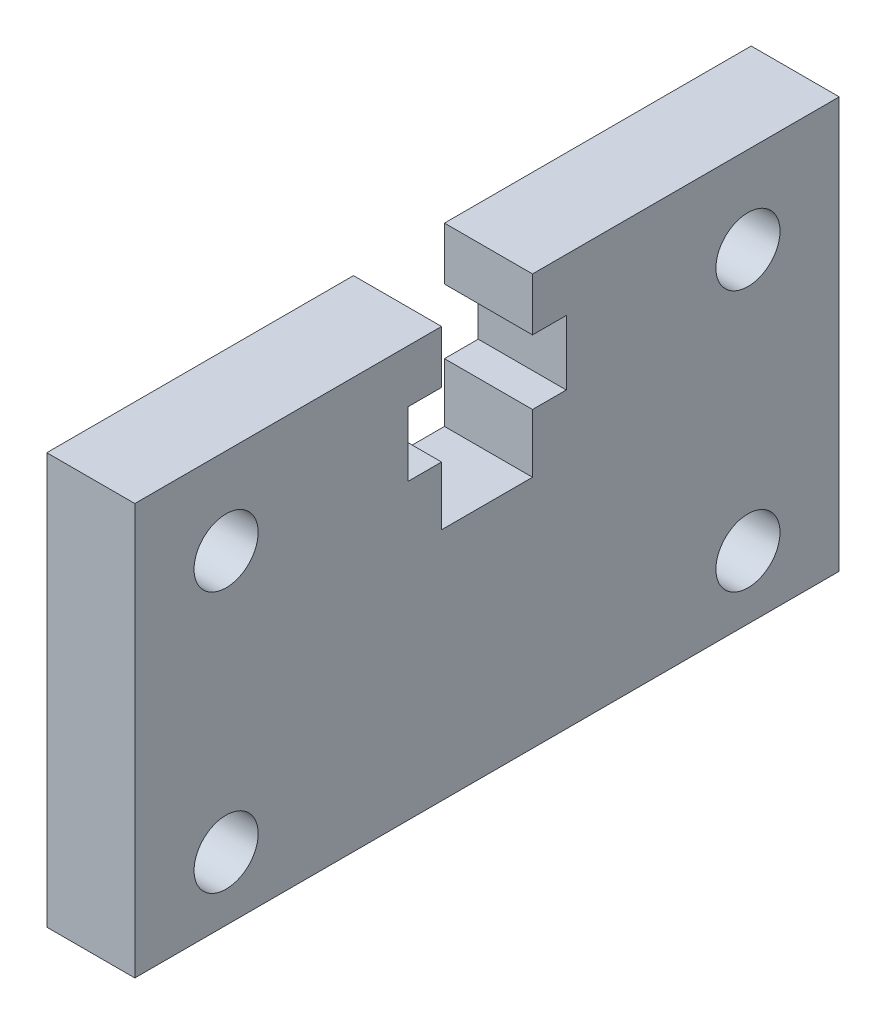
ISO-10303-21;
HEADER;
FILE_DESCRIPTION(('STEP AP214'),'2;1');
FILE_NAME('part.step','',(''),(''),'','','');
FILE_SCHEMA(('AUTOMOTIVE_DESIGN { 1 0 10303 214 1 1 1 1 }'));
ENDSEC;
DATA;
#1=APPLICATION_CONTEXT('core data for automotive mechanical design processes');
#2=APPLICATION_PROTOCOL_DEFINITION('international standard','automotive_design',2000,#1);
#3=PRODUCT_CONTEXT('',#1,'mechanical');
#4=PRODUCT('Part','Part','',(#3));
#5=PRODUCT_RELATED_PRODUCT_CATEGORY('part','',(#4));
#6=PRODUCT_DEFINITION_FORMATION('','',#4);
#7=PRODUCT_DEFINITION_CONTEXT('part definition',#1,'design');
#8=PRODUCT_DEFINITION('design','',#6,#7);
#9=PRODUCT_DEFINITION_SHAPE('','',#8);
#10=(LENGTH_UNIT() NAMED_UNIT(*) SI_UNIT(.MILLI.,.METRE.));
#11=(NAMED_UNIT(*) PLANE_ANGLE_UNIT() SI_UNIT($,.RADIAN.));
#12=(NAMED_UNIT(*) SI_UNIT($,.STERADIAN.) SOLID_ANGLE_UNIT());
#13=UNCERTAINTY_MEASURE_WITH_UNIT(LENGTH_MEASURE(1.E-05),#10,'distance_accuracy_value','');
#14=(GEOMETRIC_REPRESENTATION_CONTEXT(3) GLOBAL_UNCERTAINTY_ASSIGNED_CONTEXT((#13)) GLOBAL_UNIT_ASSIGNED_CONTEXT((#10,
#11,#12)) REPRESENTATION_CONTEXT('',''));
#15=CARTESIAN_POINT('',(0.,0.,0.));
#16=DIRECTION('',(0.,0.,1.));
#17=DIRECTION('',(1.,0.,0.));
#18=AXIS2_PLACEMENT_3D('',#15,#16,#17);
#19=CARTESIAN_POINT('',(3.,14.,0.));
#20=DIRECTION('',(0.,-1.,0.));
#21=DIRECTION('',(0.,0.,-1.));
#22=AXIS2_PLACEMENT_3D('',#19,#20,#21);
#23=PLANE('',#22);
#24=DIRECTION('',(1.,0.,0.));
#25=VECTOR('',#24,1.);
#26=CARTESIAN_POINT('',(0.,14.,-13.55));
#27=LINE('',#26,#25);
#28=CARTESIAN_POINT('',(0.,14.,-13.55));
#29=VERTEX_POINT('',#28);
#30=CARTESIAN_POINT('',(3.,14.,-13.55));
#31=VERTEX_POINT('',#30);
#32=EDGE_CURVE('E230',#29,#31,#27,.T.);
#33=ORIENTED_EDGE('',*,*,#32,.T.);
#34=DIRECTION('',(0.,0.,1.));
#35=VECTOR('',#34,1.);
#36=CARTESIAN_POINT('',(3.,14.,0.));
#37=LINE('',#36,#35);
#38=CARTESIAN_POINT('',(3.,14.,-24.));
#39=VERTEX_POINT('',#38);
#40=EDGE_CURVE('E280',#39,#31,#37,.T.);
#41=ORIENTED_EDGE('',*,*,#40,.F.);
#42=DIRECTION('',(-1.,0.,0.));
#43=VECTOR('',#42,1.);
#44=CARTESIAN_POINT('',(3.,14.,-24.));
#45=LINE('',#44,#43);
#46=CARTESIAN_POINT('',(0.,14.,-24.));
#47=VERTEX_POINT('',#46);
#48=EDGE_CURVE('E293',#39,#47,#45,.T.);
#49=ORIENTED_EDGE('',*,*,#48,.T.);
#50=DIRECTION('',(0.,0.,1.));
#51=VECTOR('',#50,1.);
#52=CARTESIAN_POINT('',(0.,14.,0.));
#53=LINE('',#52,#51);
#54=EDGE_CURVE('E276',#47,#29,#53,.T.);
#55=ORIENTED_EDGE('',*,*,#54,.T.);
#56=EDGE_LOOP('',(#33,#41,#49,#55));
#57=FACE_BOUND('',#56,.T.);
#58=ADVANCED_FACE('F33',(#57),#23,.F.);
#59=CARTESIAN_POINT('',(3.,0.,0.));
#60=DIRECTION('',(0.,0.,-1.));
#61=DIRECTION('',(-1.,0.,0.));
#62=AXIS2_PLACEMENT_3D('',#59,#60,#61);
#63=PLANE('',#62);
#64=DIRECTION('',(0.,-1.,0.));
#65=VECTOR('',#64,1.);
#66=CARTESIAN_POINT('',(0.,0.,0.));
#67=LINE('',#66,#65);
#68=CARTESIAN_POINT('',(0.,14.,0.));
#69=VERTEX_POINT('',#68);
#70=CARTESIAN_POINT('',(0.,0.,0.));
#71=VERTEX_POINT('',#70);
#72=EDGE_CURVE('E273',#69,#71,#67,.T.);
#73=ORIENTED_EDGE('',*,*,#72,.T.);
#74=DIRECTION('',(-1.,0.,0.));
#75=VECTOR('',#74,1.);
#76=CARTESIAN_POINT('',(3.,0.,0.));
#77=LINE('',#76,#75);
#78=CARTESIAN_POINT('',(3.,0.,0.));
#79=VERTEX_POINT('',#78);
#80=EDGE_CURVE('E11',#79,#71,#77,.T.);
#81=ORIENTED_EDGE('',*,*,#80,.F.);
#82=DIRECTION('',(0.,-1.,0.));
#83=VECTOR('',#82,1.);
#84=CARTESIAN_POINT('',(3.,0.,0.));
#85=LINE('',#84,#83);
#86=CARTESIAN_POINT('',(3.,14.,0.));
#87=VERTEX_POINT('',#86);
#88=EDGE_CURVE('E274',#87,#79,#85,.T.);
#89=ORIENTED_EDGE('',*,*,#88,.F.);
#90=DIRECTION('',(-1.,0.,0.));
#91=VECTOR('',#90,1.);
#92=CARTESIAN_POINT('',(3.,14.,0.));
#93=LINE('',#92,#91);
#94=EDGE_CURVE('E283',#87,#69,#93,.T.);
#95=ORIENTED_EDGE('',*,*,#94,.T.);
#96=EDGE_LOOP('',(#73,#81,#89,#95));
#97=FACE_BOUND('',#96,.T.);
#98=ADVANCED_FACE('F35',(#97),#63,.F.);
#99=CARTESIAN_POINT('',(3.,0.,0.));
#100=DIRECTION('',(0.,1.,0.));
#101=DIRECTION('',(0.,0.,1.));
#102=AXIS2_PLACEMENT_3D('',#99,#100,#101);
#103=PLANE('',#102);
#104=DIRECTION('',(0.,0.,-1.));
#105=VECTOR('',#104,1.);
#106=CARTESIAN_POINT('',(0.,0.,0.));
#107=LINE('',#106,#105);
#108=CARTESIAN_POINT('',(0.,0.,-24.));
#109=VERTEX_POINT('',#108);
#110=EDGE_CURVE('E286',#71,#109,#107,.T.);
#111=ORIENTED_EDGE('',*,*,#110,.T.);
#112=DIRECTION('',(-1.,0.,0.));
#113=VECTOR('',#112,1.);
#114=CARTESIAN_POINT('',(3.,0.,-24.));
#115=LINE('',#114,#113);
#116=CARTESIAN_POINT('',(3.,0.,-24.));
#117=VERTEX_POINT('',#116);
#118=EDGE_CURVE('E41',#117,#109,#115,.T.);
#119=ORIENTED_EDGE('',*,*,#118,.F.);
#120=DIRECTION('',(0.,0.,-1.));
#121=VECTOR('',#120,1.);
#122=CARTESIAN_POINT('',(3.,0.,0.));
#123=LINE('',#122,#121);
#124=EDGE_CURVE('E86',#79,#117,#123,.T.);
#125=ORIENTED_EDGE('',*,*,#124,.F.);
#126=ORIENTED_EDGE('',*,*,#80,.T.);
#127=EDGE_LOOP('',(#111,#119,#125,#126));
#128=FACE_BOUND('',#127,.T.);
#129=ADVANCED_FACE('F311',(#128),#103,.F.);
#130=CARTESIAN_POINT('',(3.,0.,-24.));
#131=DIRECTION('',(0.,0.,1.));
#132=DIRECTION('',(1.,0.,0.));
#133=AXIS2_PLACEMENT_3D('',#130,#131,#132);
#134=PLANE('',#133);
#135=DIRECTION('',(0.,1.,0.));
#136=VECTOR('',#135,1.);
#137=CARTESIAN_POINT('',(0.,0.,-24.));
#138=LINE('',#137,#136);
#139=EDGE_CURVE('E288',#109,#47,#138,.T.);
#140=ORIENTED_EDGE('',*,*,#139,.T.);
#141=ORIENTED_EDGE('',*,*,#48,.F.);
#142=DIRECTION('',(0.,1.,0.));
#143=VECTOR('',#142,1.);
#144=CARTESIAN_POINT('',(3.,0.,-24.));
#145=LINE('',#144,#143);
#146=EDGE_CURVE('E278',#117,#39,#145,.T.);
#147=ORIENTED_EDGE('',*,*,#146,.F.);
#148=ORIENTED_EDGE('',*,*,#118,.T.);
#149=EDGE_LOOP('',(#140,#141,#147,#148));
#150=FACE_BOUND('',#149,.T.);
#151=ADVANCED_FACE('F299',(#150),#134,.F.);
#152=CARTESIAN_POINT('',(3.,14.,-10.45));
#153=VERTEX_POINT('',#152);
#154=EDGE_CURVE('E57',#153,#87,#37,.T.);
#155=ORIENTED_EDGE('',*,*,#154,.F.);
#156=DIRECTION('',(1.,0.,0.));
#157=VECTOR('',#156,1.);
#158=CARTESIAN_POINT('',(0.,14.,-10.45));
#159=LINE('',#158,#157);
#160=CARTESIAN_POINT('',(0.,14.,-10.45));
#161=VERTEX_POINT('',#160);
#162=EDGE_CURVE('E227',#161,#153,#159,.T.);
#163=ORIENTED_EDGE('',*,*,#162,.F.);
#164=EDGE_CURVE('E79',#161,#69,#53,.T.);
#165=ORIENTED_EDGE('',*,*,#164,.T.);
#166=ORIENTED_EDGE('',*,*,#94,.F.);
#167=EDGE_LOOP('',(#155,#163,#165,#166));
#168=FACE_BOUND('',#167,.T.);
#169=ADVANCED_FACE('F317',(#168),#23,.F.);
#170=CARTESIAN_POINT('',(3.,0.,0.));
#171=DIRECTION('',(-1.,0.,0.));
#172=DIRECTION('',(0.,0.,1.));
#173=AXIS2_PLACEMENT_3D('',#170,#171,#172);
#174=PLANE('',#173);
#175=DIRECTION('',(0.,0.,1.));
#176=VECTOR('',#175,1.);
#177=CARTESIAN_POINT('',(3.,12.2,0.));
#178=LINE('',#177,#176);
#179=CARTESIAN_POINT('',(3.,12.2,-10.45));
#180=VERTEX_POINT('',#179);
#181=CARTESIAN_POINT('',(3.,12.2,-9.3));
#182=VERTEX_POINT('',#181);
#183=EDGE_CURVE('E202',#180,#182,#178,.T.);
#184=ORIENTED_EDGE('',*,*,#183,.F.);
#185=DIRECTION('',(0.,-1.,0.));
#186=VECTOR('',#185,1.);
#187=CARTESIAN_POINT('',(3.,0.,-10.45));
#188=LINE('',#187,#186);
#189=EDGE_CURVE('E161',#153,#180,#188,.T.);
#190=ORIENTED_EDGE('',*,*,#189,.F.);
#191=ORIENTED_EDGE('',*,*,#154,.T.);
#192=ORIENTED_EDGE('',*,*,#88,.T.);
#193=ORIENTED_EDGE('',*,*,#124,.T.);
#194=ORIENTED_EDGE('',*,*,#146,.T.);
#195=ORIENTED_EDGE('',*,*,#40,.T.);
#196=DIRECTION('',(0.,-1.,0.));
#197=VECTOR('',#196,1.);
#198=CARTESIAN_POINT('',(3.,0.,-13.55));
#199=LINE('',#198,#197);
#200=CARTESIAN_POINT('',(3.,12.2,-13.55));
#201=VERTEX_POINT('',#200);
#202=EDGE_CURVE('E176',#31,#201,#199,.T.);
#203=ORIENTED_EDGE('',*,*,#202,.T.);
#204=DIRECTION('',(0.,0.,1.));
#205=VECTOR('',#204,1.);
#206=CARTESIAN_POINT('',(3.,12.2,0.));
#207=LINE('',#206,#205);
#208=CARTESIAN_POINT('',(3.,12.2,-14.7));
#209=VERTEX_POINT('',#208);
#210=EDGE_CURVE('E179',#209,#201,#207,.T.);
#211=ORIENTED_EDGE('',*,*,#210,.F.);
#212=DIRECTION('',(0.,-1.,0.));
#213=VECTOR('',#212,1.);
#214=CARTESIAN_POINT('',(3.,0.,-14.7));
#215=LINE('',#214,#213);
#216=CARTESIAN_POINT('',(3.,10.,-14.7));
#217=VERTEX_POINT('',#216);
#218=EDGE_CURVE('E222',#209,#217,#215,.T.);
#219=ORIENTED_EDGE('',*,*,#218,.T.);
#220=DIRECTION('',(0.,0.,1.));
#221=VECTOR('',#220,1.);
#222=CARTESIAN_POINT('',(3.,10.,0.));
#223=LINE('',#222,#221);
#224=CARTESIAN_POINT('',(3.,10.,-13.55));
#225=VERTEX_POINT('',#224);
#226=EDGE_CURVE('E219',#217,#225,#223,.T.);
#227=ORIENTED_EDGE('',*,*,#226,.T.);
#228=DIRECTION('',(0.,-1.,0.));
#229=VECTOR('',#228,1.);
#230=CARTESIAN_POINT('',(3.,0.,-13.55));
#231=LINE('',#230,#229);
#232=CARTESIAN_POINT('',(3.,8.,-13.55));
#233=VERTEX_POINT('',#232);
#234=EDGE_CURVE('E216',#225,#233,#231,.T.);
#235=ORIENTED_EDGE('',*,*,#234,.T.);
#236=DIRECTION('',(0.,0.,-1.));
#237=VECTOR('',#236,1.);
#238=CARTESIAN_POINT('',(3.,8.00000000000001,0.));
#239=LINE('',#238,#237);
#240=CARTESIAN_POINT('',(3.,8.,-10.45));
#241=VERTEX_POINT('',#240);
#242=EDGE_CURVE('E213',#241,#233,#239,.T.);
#243=ORIENTED_EDGE('',*,*,#242,.F.);
#244=DIRECTION('',(0.,-1.,0.));
#245=VECTOR('',#244,1.);
#246=CARTESIAN_POINT('',(3.,0.,-10.45));
#247=LINE('',#246,#245);
#248=CARTESIAN_POINT('',(3.,10.,-10.45));
#249=VERTEX_POINT('',#248);
#250=EDGE_CURVE('E210',#249,#241,#247,.T.);
#251=ORIENTED_EDGE('',*,*,#250,.F.);
#252=DIRECTION('',(0.,0.,1.));
#253=VECTOR('',#252,1.);
#254=CARTESIAN_POINT('',(3.,10.,0.));
#255=LINE('',#254,#253);
#256=CARTESIAN_POINT('',(3.,10.,-9.3));
#257=VERTEX_POINT('',#256);
#258=EDGE_CURVE('E207',#249,#257,#255,.T.);
#259=ORIENTED_EDGE('',*,*,#258,.T.);
#260=DIRECTION('',(0.,-1.,0.));
#261=VECTOR('',#260,1.);
#262=CARTESIAN_POINT('',(3.,0.,-9.3));
#263=LINE('',#262,#261);
#264=EDGE_CURVE('E204',#182,#257,#263,.T.);
#265=ORIENTED_EDGE('',*,*,#264,.F.);
#266=EDGE_LOOP('',(#184,#190,#191,#192,#193,#194,#195,#203,#211,#219,#227,#235,#243,#251,#259,#265));
#267=FACE_BOUND('',#266,.T.);
#268=CARTESIAN_POINT('',(3.,11.05,-3.11));
#269=DIRECTION('',(1.,0.,0.));
#270=DIRECTION('',(0.,0.,-1.));
#271=AXIS2_PLACEMENT_3D('',#268,#269,#270);
#272=CIRCLE('',#271,1.0922);
#273=CARTESIAN_POINT('',(3.,11.05,-4.2022));
#274=VERTEX_POINT('',#273);
#275=EDGE_CURVE('E229',#274,#274,#272,.T.);
#276=ORIENTED_EDGE('',*,*,#275,.F.);
#277=EDGE_LOOP('',(#276));
#278=FACE_BOUND('',#277,.T.);
#279=CARTESIAN_POINT('',(3.,11.049,-20.8899999718785));
#280=DIRECTION('',(1.,0.,0.));
#281=DIRECTION('',(0.,0.,-1.));
#282=AXIS2_PLACEMENT_3D('',#279,#280,#281);
#283=CIRCLE('',#282,1.0922);
#284=CARTESIAN_POINT('',(3.,11.049,-21.9821999718785));
#285=VERTEX_POINT('',#284);
#286=EDGE_CURVE('E255',#285,#285,#283,.T.);
#287=ORIENTED_EDGE('',*,*,#286,.F.);
#288=EDGE_LOOP('',(#287));
#289=FACE_BOUND('',#288,.T.);
#290=CARTESIAN_POINT('',(3.,2.159,-20.889999943757));
#291=DIRECTION('',(1.,0.,0.));
#292=DIRECTION('',(0.,0.,-1.));
#293=AXIS2_PLACEMENT_3D('',#290,#291,#292);
#294=CIRCLE('',#293,1.0922);
#295=CARTESIAN_POINT('',(3.,2.159,-21.982199943757));
#296=VERTEX_POINT('',#295);
#297=EDGE_CURVE('E261',#296,#296,#294,.T.);
#298=ORIENTED_EDGE('',*,*,#297,.F.);
#299=EDGE_LOOP('',(#298));
#300=FACE_BOUND('',#299,.T.);
#301=CARTESIAN_POINT('',(3.,2.16,-3.11));
#302=DIRECTION('',(1.,0.,0.));
#303=DIRECTION('',(0.,0.,-1.));
#304=AXIS2_PLACEMENT_3D('',#301,#302,#303);
#305=CIRCLE('',#304,1.0922);
#306=CARTESIAN_POINT('',(3.,2.16,-4.2022));
#307=VERTEX_POINT('',#306);
#308=EDGE_CURVE('E267',#307,#307,#305,.T.);
#309=ORIENTED_EDGE('',*,*,#308,.F.);
#310=EDGE_LOOP('',(#309));
#311=FACE_BOUND('',#310,.T.);
#312=ADVANCED_FACE('F305',(#267,#278,#289,#300,#311),#174,.F.);
#313=CARTESIAN_POINT('',(0.,0.,0.));
#314=DIRECTION('',(-1.,0.,0.));
#315=DIRECTION('',(0.,0.,1.));
#316=AXIS2_PLACEMENT_3D('',#313,#314,#315);
#317=PLANE('',#316);
#318=DIRECTION('',(0.,-1.,0.));
#319=VECTOR('',#318,1.);
#320=CARTESIAN_POINT('',(0.,0.,-10.45));
#321=LINE('',#320,#319);
#322=CARTESIAN_POINT('',(0.,12.2,-10.45));
#323=VERTEX_POINT('',#322);
#324=EDGE_CURVE('E160',#161,#323,#321,.T.);
#325=ORIENTED_EDGE('',*,*,#324,.T.);
#326=DIRECTION('',(0.,0.,1.));
#327=VECTOR('',#326,1.);
#328=CARTESIAN_POINT('',(0.,12.2,0.));
#329=LINE('',#328,#327);
#330=CARTESIAN_POINT('',(0.,12.2,-9.3));
#331=VERTEX_POINT('',#330);
#332=EDGE_CURVE('E169',#323,#331,#329,.T.);
#333=ORIENTED_EDGE('',*,*,#332,.T.);
#334=DIRECTION('',(0.,-1.,0.));
#335=VECTOR('',#334,1.);
#336=CARTESIAN_POINT('',(0.,0.,-9.3));
#337=LINE('',#336,#335);
#338=CARTESIAN_POINT('',(0.,10.,-9.3));
#339=VERTEX_POINT('',#338);
#340=EDGE_CURVE('E48',#331,#339,#337,.T.);
#341=ORIENTED_EDGE('',*,*,#340,.T.);
#342=DIRECTION('',(0.,0.,1.));
#343=VECTOR('',#342,1.);
#344=CARTESIAN_POINT('',(0.,10.,0.));
#345=LINE('',#344,#343);
#346=CARTESIAN_POINT('',(0.,10.,-10.45));
#347=VERTEX_POINT('',#346);
#348=EDGE_CURVE('E183',#347,#339,#345,.T.);
#349=ORIENTED_EDGE('',*,*,#348,.F.);
#350=DIRECTION('',(0.,-1.,0.));
#351=VECTOR('',#350,1.);
#352=CARTESIAN_POINT('',(0.,0.,-10.45));
#353=LINE('',#352,#351);
#354=CARTESIAN_POINT('',(0.,8.,-10.45));
#355=VERTEX_POINT('',#354);
#356=EDGE_CURVE('E185',#347,#355,#353,.T.);
#357=ORIENTED_EDGE('',*,*,#356,.T.);
#358=DIRECTION('',(0.,0.,-1.));
#359=VECTOR('',#358,1.);
#360=CARTESIAN_POINT('',(0.,8.00000000000001,0.));
#361=LINE('',#360,#359);
#362=CARTESIAN_POINT('',(0.,8.,-13.55));
#363=VERTEX_POINT('',#362);
#364=EDGE_CURVE('E188',#355,#363,#361,.T.);
#365=ORIENTED_EDGE('',*,*,#364,.T.);
#366=DIRECTION('',(0.,-1.,0.));
#367=VECTOR('',#366,1.);
#368=CARTESIAN_POINT('',(0.,0.,-13.55));
#369=LINE('',#368,#367);
#370=CARTESIAN_POINT('',(0.,10.,-13.55));
#371=VERTEX_POINT('',#370);
#372=EDGE_CURVE('E191',#371,#363,#369,.T.);
#373=ORIENTED_EDGE('',*,*,#372,.F.);
#374=DIRECTION('',(0.,0.,1.));
#375=VECTOR('',#374,1.);
#376=CARTESIAN_POINT('',(0.,10.,0.));
#377=LINE('',#376,#375);
#378=CARTESIAN_POINT('',(0.,10.,-14.7));
#379=VERTEX_POINT('',#378);
#380=EDGE_CURVE('E193',#379,#371,#377,.T.);
#381=ORIENTED_EDGE('',*,*,#380,.F.);
#382=DIRECTION('',(0.,-1.,0.));
#383=VECTOR('',#382,1.);
#384=CARTESIAN_POINT('',(0.,0.,-14.7));
#385=LINE('',#384,#383);
#386=CARTESIAN_POINT('',(0.,12.2,-14.7));
#387=VERTEX_POINT('',#386);
#388=EDGE_CURVE('E195',#387,#379,#385,.T.);
#389=ORIENTED_EDGE('',*,*,#388,.F.);
#390=DIRECTION('',(0.,0.,1.));
#391=VECTOR('',#390,1.);
#392=CARTESIAN_POINT('',(0.,12.2,0.));
#393=LINE('',#392,#391);
#394=CARTESIAN_POINT('',(0.,12.2,-13.55));
#395=VERTEX_POINT('',#394);
#396=EDGE_CURVE('E197',#387,#395,#393,.T.);
#397=ORIENTED_EDGE('',*,*,#396,.T.);
#398=DIRECTION('',(0.,-1.,0.));
#399=VECTOR('',#398,1.);
#400=CARTESIAN_POINT('',(0.,0.,-13.55));
#401=LINE('',#400,#399);
#402=EDGE_CURVE('E166',#29,#395,#401,.T.);
#403=ORIENTED_EDGE('',*,*,#402,.F.);
#404=ORIENTED_EDGE('',*,*,#54,.F.);
#405=ORIENTED_EDGE('',*,*,#139,.F.);
#406=ORIENTED_EDGE('',*,*,#110,.F.);
#407=ORIENTED_EDGE('',*,*,#72,.F.);
#408=ORIENTED_EDGE('',*,*,#164,.F.);
#409=EDGE_LOOP('',(#325,#333,#341,#349,#357,#365,#373,#381,#389,#397,#403,#404,#405,#406,#407,#408));
#410=FACE_BOUND('',#409,.T.);
#411=CARTESIAN_POINT('',(0.,11.05,-3.11));
#412=DIRECTION('',(1.,0.,0.));
#413=DIRECTION('',(0.,0.,-1.));
#414=AXIS2_PLACEMENT_3D('',#411,#412,#413);
#415=CIRCLE('',#414,1.0922);
#416=CARTESIAN_POINT('',(0.,11.05,-4.2022));
#417=VERTEX_POINT('',#416);
#418=EDGE_CURVE('E252',#417,#417,#415,.T.);
#419=ORIENTED_EDGE('',*,*,#418,.T.);
#420=EDGE_LOOP('',(#419));
#421=FACE_BOUND('',#420,.T.);
#422=CARTESIAN_POINT('',(0.,11.049,-20.8899999718785));
#423=DIRECTION('',(1.,0.,0.));
#424=DIRECTION('',(0.,0.,-1.));
#425=AXIS2_PLACEMENT_3D('',#422,#423,#424);
#426=CIRCLE('',#425,1.0922);
#427=CARTESIAN_POINT('',(0.,11.049,-21.9821999718785));
#428=VERTEX_POINT('',#427);
#429=EDGE_CURVE('E258',#428,#428,#426,.T.);
#430=ORIENTED_EDGE('',*,*,#429,.T.);
#431=EDGE_LOOP('',(#430));
#432=FACE_BOUND('',#431,.T.);
#433=CARTESIAN_POINT('',(0.,2.159,-20.889999943757));
#434=DIRECTION('',(1.,0.,0.));
#435=DIRECTION('',(0.,0.,-1.));
#436=AXIS2_PLACEMENT_3D('',#433,#434,#435);
#437=CIRCLE('',#436,1.0922);
#438=CARTESIAN_POINT('',(0.,2.159,-21.982199943757));
#439=VERTEX_POINT('',#438);
#440=EDGE_CURVE('E264',#439,#439,#437,.T.);
#441=ORIENTED_EDGE('',*,*,#440,.T.);
#442=EDGE_LOOP('',(#441));
#443=FACE_BOUND('',#442,.T.);
#444=CARTESIAN_POINT('',(0.,2.16,-3.11));
#445=DIRECTION('',(1.,0.,0.));
#446=DIRECTION('',(0.,0.,-1.));
#447=AXIS2_PLACEMENT_3D('',#444,#445,#446);
#448=CIRCLE('',#447,1.0922);
#449=CARTESIAN_POINT('',(0.,2.16,-4.2022));
#450=VERTEX_POINT('',#449);
#451=EDGE_CURVE('E270',#450,#450,#448,.T.);
#452=ORIENTED_EDGE('',*,*,#451,.T.);
#453=EDGE_LOOP('',(#452));
#454=FACE_BOUND('',#453,.T.);
#455=ADVANCED_FACE('F173',(#410,#421,#432,#443,#454),#317,.T.);
#456=CARTESIAN_POINT('',(3.,2.16,-3.11));
#457=DIRECTION('',(1.,0.,0.));
#458=DIRECTION('',(0.,0.,-1.));
#459=AXIS2_PLACEMENT_3D('',#456,#457,#458);
#460=CYLINDRICAL_SURFACE('',#459,1.0922);
#461=ORIENTED_EDGE('',*,*,#451,.F.);
#462=EDGE_LOOP('',(#461));
#463=FACE_BOUND('',#462,.T.);
#464=ORIENTED_EDGE('',*,*,#308,.T.);
#465=EDGE_LOOP('',(#464));
#466=FACE_BOUND('',#465,.T.);
#467=ADVANCED_FACE('F400',(#463,#466),#460,.F.);
#468=CARTESIAN_POINT('',(3.,2.159,-20.889999943757));
#469=DIRECTION('',(1.,0.,0.));
#470=DIRECTION('',(0.,0.,-1.));
#471=AXIS2_PLACEMENT_3D('',#468,#469,#470);
#472=CYLINDRICAL_SURFACE('',#471,1.0922);
#473=ORIENTED_EDGE('',*,*,#440,.F.);
#474=EDGE_LOOP('',(#473));
#475=FACE_BOUND('',#474,.T.);
#476=ORIENTED_EDGE('',*,*,#297,.T.);
#477=EDGE_LOOP('',(#476));
#478=FACE_BOUND('',#477,.T.);
#479=ADVANCED_FACE('F396',(#475,#478),#472,.F.);
#480=CARTESIAN_POINT('',(3.,11.049,-20.8899999718785));
#481=DIRECTION('',(1.,0.,0.));
#482=DIRECTION('',(0.,0.,-1.));
#483=AXIS2_PLACEMENT_3D('',#480,#481,#482);
#484=CYLINDRICAL_SURFACE('',#483,1.0922);
#485=ORIENTED_EDGE('',*,*,#429,.F.);
#486=EDGE_LOOP('',(#485));
#487=FACE_BOUND('',#486,.T.);
#488=ORIENTED_EDGE('',*,*,#286,.T.);
#489=EDGE_LOOP('',(#488));
#490=FACE_BOUND('',#489,.T.);
#491=ADVANCED_FACE('F392',(#487,#490),#484,.F.);
#492=CARTESIAN_POINT('',(3.,11.05,-3.11));
#493=DIRECTION('',(1.,0.,0.));
#494=DIRECTION('',(0.,0.,-1.));
#495=AXIS2_PLACEMENT_3D('',#492,#493,#494);
#496=CYLINDRICAL_SURFACE('',#495,1.0922);
#497=ORIENTED_EDGE('',*,*,#418,.F.);
#498=EDGE_LOOP('',(#497));
#499=FACE_BOUND('',#498,.T.);
#500=ORIENTED_EDGE('',*,*,#275,.T.);
#501=EDGE_LOOP('',(#500));
#502=FACE_BOUND('',#501,.T.);
#503=ADVANCED_FACE('F371',(#499,#502),#496,.F.);
#504=CARTESIAN_POINT('',(0.,0.,-10.45));
#505=DIRECTION('',(0.,0.,1.));
#506=DIRECTION('',(0.,-1.,0.));
#507=AXIS2_PLACEMENT_3D('',#504,#505,#506);
#508=PLANE('',#507);
#509=ORIENTED_EDGE('',*,*,#189,.T.);
#510=DIRECTION('',(1.,0.,0.));
#511=VECTOR('',#510,1.);
#512=CARTESIAN_POINT('',(0.,12.2,-10.45));
#513=LINE('',#512,#511);
#514=EDGE_CURVE('E156',#323,#180,#513,.T.);
#515=ORIENTED_EDGE('',*,*,#514,.F.);
#516=ORIENTED_EDGE('',*,*,#324,.F.);
#517=ORIENTED_EDGE('',*,*,#162,.T.);
#518=EDGE_LOOP('',(#509,#515,#516,#517));
#519=FACE_BOUND('',#518,.T.);
#520=ADVANCED_FACE('F158',(#519),#508,.F.);
#521=CARTESIAN_POINT('',(0.,0.,-13.55));
#522=DIRECTION('',(0.,0.,1.));
#523=DIRECTION('',(0.,-1.,0.));
#524=AXIS2_PLACEMENT_3D('',#521,#522,#523);
#525=PLANE('',#524);
#526=ORIENTED_EDGE('',*,*,#202,.F.);
#527=ORIENTED_EDGE('',*,*,#32,.F.);
#528=ORIENTED_EDGE('',*,*,#402,.T.);
#529=DIRECTION('',(1.,0.,0.));
#530=VECTOR('',#529,1.);
#531=CARTESIAN_POINT('',(0.,12.2,-13.55));
#532=LINE('',#531,#530);
#533=EDGE_CURVE('E233',#395,#201,#532,.T.);
#534=ORIENTED_EDGE('',*,*,#533,.T.);
#535=EDGE_LOOP('',(#526,#527,#528,#534));
#536=FACE_BOUND('',#535,.T.);
#537=ADVANCED_FACE('F363',(#536),#525,.T.);
#538=CARTESIAN_POINT('',(0.,12.2,0.));
#539=DIRECTION('',(0.,1.,0.));
#540=DIRECTION('',(0.,0.,1.));
#541=AXIS2_PLACEMENT_3D('',#538,#539,#540);
#542=PLANE('',#541);
#543=ORIENTED_EDGE('',*,*,#210,.T.);
#544=ORIENTED_EDGE('',*,*,#533,.F.);
#545=ORIENTED_EDGE('',*,*,#396,.F.);
#546=DIRECTION('',(1.,0.,0.));
#547=VECTOR('',#546,1.);
#548=CARTESIAN_POINT('',(0.,12.2,-14.7));
#549=LINE('',#548,#547);
#550=EDGE_CURVE('E235',#387,#209,#549,.T.);
#551=ORIENTED_EDGE('',*,*,#550,.T.);
#552=EDGE_LOOP('',(#543,#544,#545,#551));
#553=FACE_BOUND('',#552,.T.);
#554=ADVANCED_FACE('F361',(#553),#542,.F.);
#555=CARTESIAN_POINT('',(0.,0.,-14.7));
#556=DIRECTION('',(0.,0.,1.));
#557=DIRECTION('',(1.,0.,0.));
#558=AXIS2_PLACEMENT_3D('',#555,#556,#557);
#559=PLANE('',#558);
#560=ORIENTED_EDGE('',*,*,#218,.F.);
#561=ORIENTED_EDGE('',*,*,#550,.F.);
#562=ORIENTED_EDGE('',*,*,#388,.T.);
#563=DIRECTION('',(1.,0.,0.));
#564=VECTOR('',#563,1.);
#565=CARTESIAN_POINT('',(0.,10.,-14.7));
#566=LINE('',#565,#564);
#567=EDGE_CURVE('E237',#379,#217,#566,.T.);
#568=ORIENTED_EDGE('',*,*,#567,.T.);
#569=EDGE_LOOP('',(#560,#561,#562,#568));
#570=FACE_BOUND('',#569,.T.);
#571=ADVANCED_FACE('F357',(#570),#559,.T.);
#572=CARTESIAN_POINT('',(0.,10.,0.));
#573=DIRECTION('',(0.,1.,0.));
#574=DIRECTION('',(0.,0.,1.));
#575=AXIS2_PLACEMENT_3D('',#572,#573,#574);
#576=PLANE('',#575);
#577=ORIENTED_EDGE('',*,*,#226,.F.);
#578=ORIENTED_EDGE('',*,*,#567,.F.);
#579=ORIENTED_EDGE('',*,*,#380,.T.);
#580=DIRECTION('',(1.,0.,0.));
#581=VECTOR('',#580,1.);
#582=CARTESIAN_POINT('',(0.,10.,-13.55));
#583=LINE('',#582,#581);
#584=EDGE_CURVE('E239',#371,#225,#583,.T.);
#585=ORIENTED_EDGE('',*,*,#584,.T.);
#586=EDGE_LOOP('',(#577,#578,#579,#585));
#587=FACE_BOUND('',#586,.T.);
#588=ADVANCED_FACE('F353',(#587),#576,.T.);
#589=CARTESIAN_POINT('',(0.,0.,-13.55));
#590=DIRECTION('',(0.,0.,1.));
#591=DIRECTION('',(0.,-1.,0.));
#592=AXIS2_PLACEMENT_3D('',#589,#590,#591);
#593=PLANE('',#592);
#594=ORIENTED_EDGE('',*,*,#234,.F.);
#595=ORIENTED_EDGE('',*,*,#584,.F.);
#596=ORIENTED_EDGE('',*,*,#372,.T.);
#597=DIRECTION('',(1.,0.,0.));
#598=VECTOR('',#597,1.);
#599=CARTESIAN_POINT('',(0.,8.,-13.55));
#600=LINE('',#599,#598);
#601=EDGE_CURVE('E241',#363,#233,#600,.T.);
#602=ORIENTED_EDGE('',*,*,#601,.T.);
#603=EDGE_LOOP('',(#594,#595,#596,#602));
#604=FACE_BOUND('',#603,.T.);
#605=ADVANCED_FACE('F350',(#604),#593,.T.);
#606=CARTESIAN_POINT('',(0.,8.00000000000001,0.));
#607=DIRECTION('',(0.,-1.,0.));
#608=DIRECTION('',(0.,0.,-1.));
#609=AXIS2_PLACEMENT_3D('',#606,#607,#608);
#610=PLANE('',#609);
#611=ORIENTED_EDGE('',*,*,#242,.T.);
#612=ORIENTED_EDGE('',*,*,#601,.F.);
#613=ORIENTED_EDGE('',*,*,#364,.F.);
#614=DIRECTION('',(1.,0.,0.));
#615=VECTOR('',#614,1.);
#616=CARTESIAN_POINT('',(0.,8.,-10.45));
#617=LINE('',#616,#615);
#618=EDGE_CURVE('E243',#355,#241,#617,.T.);
#619=ORIENTED_EDGE('',*,*,#618,.T.);
#620=EDGE_LOOP('',(#611,#612,#613,#619));
#621=FACE_BOUND('',#620,.T.);
#622=ADVANCED_FACE('F343',(#621),#610,.F.);
#623=CARTESIAN_POINT('',(0.,0.,-10.45));
#624=DIRECTION('',(0.,0.,1.));
#625=DIRECTION('',(0.,-1.,0.));
#626=AXIS2_PLACEMENT_3D('',#623,#624,#625);
#627=PLANE('',#626);
#628=ORIENTED_EDGE('',*,*,#250,.T.);
#629=ORIENTED_EDGE('',*,*,#618,.F.);
#630=ORIENTED_EDGE('',*,*,#356,.F.);
#631=DIRECTION('',(1.,0.,0.));
#632=VECTOR('',#631,1.);
#633=CARTESIAN_POINT('',(0.,10.,-10.45));
#634=LINE('',#633,#632);
#635=EDGE_CURVE('E245',#347,#249,#634,.T.);
#636=ORIENTED_EDGE('',*,*,#635,.T.);
#637=EDGE_LOOP('',(#628,#629,#630,#636));
#638=FACE_BOUND('',#637,.T.);
#639=ADVANCED_FACE('F338',(#638),#627,.F.);
#640=CARTESIAN_POINT('',(0.,10.,0.));
#641=DIRECTION('',(0.,1.,0.));
#642=DIRECTION('',(0.,0.,1.));
#643=AXIS2_PLACEMENT_3D('',#640,#641,#642);
#644=PLANE('',#643);
#645=ORIENTED_EDGE('',*,*,#258,.F.);
#646=ORIENTED_EDGE('',*,*,#635,.F.);
#647=ORIENTED_EDGE('',*,*,#348,.T.);
#648=DIRECTION('',(1.,0.,0.));
#649=VECTOR('',#648,1.);
#650=CARTESIAN_POINT('',(0.,10.,-9.3));
#651=LINE('',#650,#649);
#652=EDGE_CURVE('E247',#339,#257,#651,.T.);
#653=ORIENTED_EDGE('',*,*,#652,.T.);
#654=EDGE_LOOP('',(#645,#646,#647,#653));
#655=FACE_BOUND('',#654,.T.);
#656=ADVANCED_FACE('F336',(#655),#644,.T.);
#657=CARTESIAN_POINT('',(0.,0.,-9.3));
#658=DIRECTION('',(0.,0.,1.));
#659=DIRECTION('',(1.,0.,0.));
#660=AXIS2_PLACEMENT_3D('',#657,#658,#659);
#661=PLANE('',#660);
#662=ORIENTED_EDGE('',*,*,#264,.T.);
#663=ORIENTED_EDGE('',*,*,#652,.F.);
#664=ORIENTED_EDGE('',*,*,#340,.F.);
#665=DIRECTION('',(1.,0.,0.));
#666=VECTOR('',#665,1.);
#667=CARTESIAN_POINT('',(0.,12.2,-9.3));
#668=LINE('',#667,#666);
#669=EDGE_CURVE('E165',#331,#182,#668,.T.);
#670=ORIENTED_EDGE('',*,*,#669,.T.);
#671=EDGE_LOOP('',(#662,#663,#664,#670));
#672=FACE_BOUND('',#671,.T.);
#673=ADVANCED_FACE('F332',(#672),#661,.F.);
#674=CARTESIAN_POINT('',(0.,12.2,0.));
#675=DIRECTION('',(0.,1.,0.));
#676=DIRECTION('',(0.,0.,1.));
#677=AXIS2_PLACEMENT_3D('',#674,#675,#676);
#678=PLANE('',#677);
#679=ORIENTED_EDGE('',*,*,#183,.T.);
#680=ORIENTED_EDGE('',*,*,#669,.F.);
#681=ORIENTED_EDGE('',*,*,#332,.F.);
#682=ORIENTED_EDGE('',*,*,#514,.T.);
#683=EDGE_LOOP('',(#679,#680,#681,#682));
#684=FACE_BOUND('',#683,.T.);
#685=ADVANCED_FACE('F170',(#684),#678,.F.);
#686=CLOSED_SHELL('',(#58,#98,#129,#151,#169,#312,#455,#467,#479,#491,#503,#520,#537,#554,#571,
#588,#605,#622,#639,#656,#673,#685));
#687=MANIFOLD_SOLID_BREP('B2',#686);
#688=ADVANCED_BREP_SHAPE_REPRESENTATION('',(#18,#687),#14);
#689=SHAPE_DEFINITION_REPRESENTATION(#9,#688);
ENDSEC;
END-ISO-10303-21;
